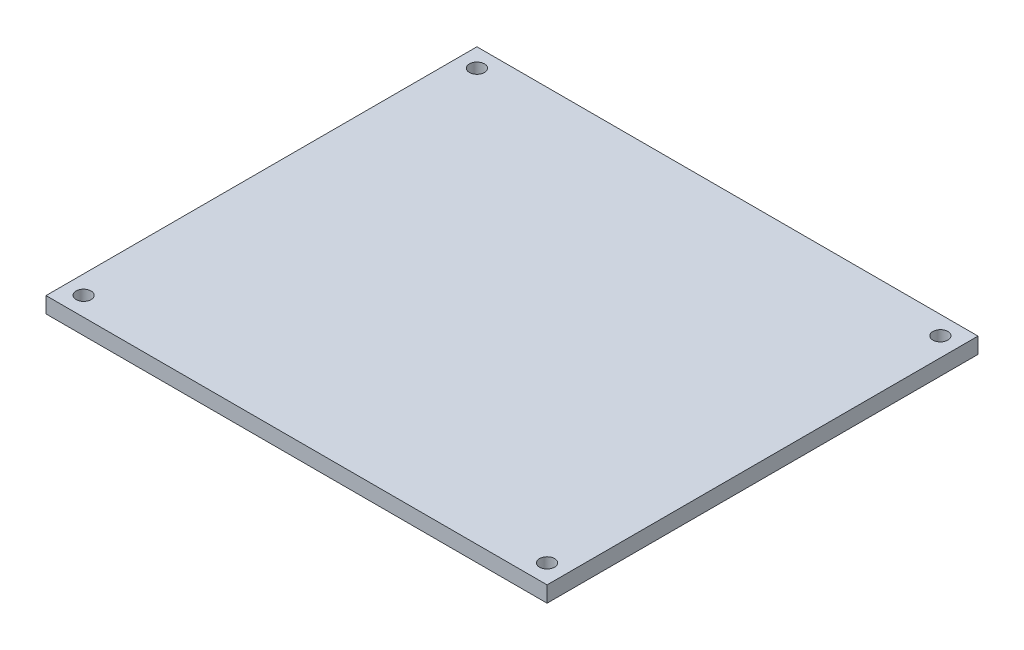
ISO-10303-21;
HEADER;
FILE_DESCRIPTION(('STEP AP214'),'2;1');
FILE_NAME('part.step','',(''),(''),'','','');
FILE_SCHEMA(('AUTOMOTIVE_DESIGN { 1 0 10303 214 1 1 1 1 }'));
ENDSEC;
DATA;
#1=APPLICATION_CONTEXT('core data for automotive mechanical design processes');
#2=APPLICATION_PROTOCOL_DEFINITION('international standard','automotive_design',2000,#1);
#3=PRODUCT_CONTEXT('',#1,'mechanical');
#4=PRODUCT('Part','Part','',(#3));
#5=PRODUCT_RELATED_PRODUCT_CATEGORY('part','',(#4));
#6=PRODUCT_DEFINITION_FORMATION('','',#4);
#7=PRODUCT_DEFINITION_CONTEXT('part definition',#1,'design');
#8=PRODUCT_DEFINITION('design','',#6,#7);
#9=PRODUCT_DEFINITION_SHAPE('','',#8);
#10=(LENGTH_UNIT() NAMED_UNIT(*) SI_UNIT(.MILLI.,.METRE.));
#11=(NAMED_UNIT(*) PLANE_ANGLE_UNIT() SI_UNIT($,.RADIAN.));
#12=(NAMED_UNIT(*) SI_UNIT($,.STERADIAN.) SOLID_ANGLE_UNIT());
#13=UNCERTAINTY_MEASURE_WITH_UNIT(LENGTH_MEASURE(1.E-05),#10,'distance_accuracy_value','');
#14=(GEOMETRIC_REPRESENTATION_CONTEXT(3) GLOBAL_UNCERTAINTY_ASSIGNED_CONTEXT((#13)) GLOBAL_UNIT_ASSIGNED_CONTEXT((#10,
#11,#12)) REPRESENTATION_CONTEXT('',''));
#15=CARTESIAN_POINT('',(0.,0.,0.));
#16=DIRECTION('',(0.,0.,1.));
#17=DIRECTION('',(1.,0.,0.));
#18=AXIS2_PLACEMENT_3D('',#15,#16,#17);
#19=CARTESIAN_POINT('',(0.,3.175,0.));
#20=DIRECTION('',(0.,-1.,0.));
#21=DIRECTION('',(0.,0.,-1.));
#22=AXIS2_PLACEMENT_3D('',#19,#20,#21);
#23=PLANE('',#22);
#24=DIRECTION('',(0.,0.,1.));
#25=VECTOR('',#24,1.);
#26=CARTESIAN_POINT('',(0.,3.175,0.));
#27=LINE('',#26,#25);
#28=CARTESIAN_POINT('',(0.,3.175,-86.));
#29=VERTEX_POINT('',#28);
#30=CARTESIAN_POINT('',(0.,3.175,0.));
#31=VERTEX_POINT('',#30);
#32=EDGE_CURVE('E90',#29,#31,#27,.T.);
#33=ORIENTED_EDGE('',*,*,#32,.T.);
#34=DIRECTION('',(1.,0.,0.));
#35=VECTOR('',#34,1.);
#36=CARTESIAN_POINT('',(0.,3.175,0.));
#37=LINE('',#36,#35);
#38=CARTESIAN_POINT('',(100.,3.175,0.));
#39=VERTEX_POINT('',#38);
#40=EDGE_CURVE('E85',#31,#39,#37,.T.);
#41=ORIENTED_EDGE('',*,*,#40,.T.);
#42=DIRECTION('',(0.,0.,-1.));
#43=VECTOR('',#42,1.);
#44=CARTESIAN_POINT('',(100.,3.175,0.));
#45=LINE('',#44,#43);
#46=CARTESIAN_POINT('',(100.,3.175,-86.));
#47=VERTEX_POINT('',#46);
#48=EDGE_CURVE('E88',#39,#47,#45,.T.);
#49=ORIENTED_EDGE('',*,*,#48,.T.);
#50=DIRECTION('',(-1.,0.,0.));
#51=VECTOR('',#50,1.);
#52=CARTESIAN_POINT('',(0.,3.175,-86.));
#53=LINE('',#52,#51);
#54=EDGE_CURVE('E55',#47,#29,#53,.T.);
#55=ORIENTED_EDGE('',*,*,#54,.T.);
#56=EDGE_LOOP('',(#33,#41,#49,#55));
#57=FACE_BOUND('',#56,.T.);
#58=CARTESIAN_POINT('',(3.69999999999998,3.175,-3.8));
#59=DIRECTION('',(0.,1.,0.));
#60=DIRECTION('',(0.,0.,1.));
#61=AXIS2_PLACEMENT_3D('',#58,#59,#60);
#62=CIRCLE('',#61,1.5);
#63=CARTESIAN_POINT('',(3.69999999999998,3.175,-2.3));
#64=VERTEX_POINT('',#63);
#65=EDGE_CURVE('E105',#64,#64,#62,.T.);
#66=ORIENTED_EDGE('',*,*,#65,.F.);
#67=EDGE_LOOP('',(#66));
#68=FACE_BOUND('',#67,.T.);
#69=CARTESIAN_POINT('',(96.2,3.175,-3.8));
#70=DIRECTION('',(0.,1.,0.));
#71=DIRECTION('',(0.,0.,1.));
#72=AXIS2_PLACEMENT_3D('',#69,#70,#71);
#73=CIRCLE('',#72,1.5);
#74=CARTESIAN_POINT('',(96.2,3.175,-2.3));
#75=VERTEX_POINT('',#74);
#76=EDGE_CURVE('E120',#75,#75,#73,.T.);
#77=ORIENTED_EDGE('',*,*,#76,.F.);
#78=EDGE_LOOP('',(#77));
#79=FACE_BOUND('',#78,.T.);
#80=CARTESIAN_POINT('',(3.69999999999997,3.175,-82.3));
#81=DIRECTION('',(0.,1.,0.));
#82=DIRECTION('',(0.,0.,1.));
#83=AXIS2_PLACEMENT_3D('',#80,#81,#82);
#84=CIRCLE('',#83,1.5);
#85=CARTESIAN_POINT('',(3.69999999999997,3.175,-80.8));
#86=VERTEX_POINT('',#85);
#87=EDGE_CURVE('E126',#86,#86,#84,.T.);
#88=ORIENTED_EDGE('',*,*,#87,.F.);
#89=EDGE_LOOP('',(#88));
#90=FACE_BOUND('',#89,.T.);
#91=CARTESIAN_POINT('',(96.2,3.175,-82.3));
#92=DIRECTION('',(0.,1.,0.));
#93=DIRECTION('',(0.,0.,1.));
#94=AXIS2_PLACEMENT_3D('',#91,#92,#93);
#95=CIRCLE('',#94,1.5);
#96=CARTESIAN_POINT('',(96.2,3.175,-80.8));
#97=VERTEX_POINT('',#96);
#98=EDGE_CURVE('E132',#97,#97,#95,.T.);
#99=ORIENTED_EDGE('',*,*,#98,.F.);
#100=EDGE_LOOP('',(#99));
#101=FACE_BOUND('',#100,.T.);
#102=ADVANCED_FACE('F38',(#57,#68,#79,#90,#101),#23,.F.);
#103=CARTESIAN_POINT('',(0.,0.,0.));
#104=DIRECTION('',(0.,-1.,0.));
#105=DIRECTION('',(0.,0.,-1.));
#106=AXIS2_PLACEMENT_3D('',#103,#104,#105);
#107=PLANE('',#106);
#108=CARTESIAN_POINT('',(3.69999999999997,0.,-82.3));
#109=DIRECTION('',(0.,1.,0.));
#110=DIRECTION('',(0.,0.,1.));
#111=AXIS2_PLACEMENT_3D('',#108,#109,#110);
#112=CIRCLE('',#111,1.5);
#113=CARTESIAN_POINT('',(3.69999999999997,0.,-80.8));
#114=VERTEX_POINT('',#113);
#115=EDGE_CURVE('E129',#114,#114,#112,.T.);
#116=ORIENTED_EDGE('',*,*,#115,.T.);
#117=EDGE_LOOP('',(#116));
#118=FACE_BOUND('',#117,.T.);
#119=CARTESIAN_POINT('',(3.69999999999998,0.,-3.8));
#120=DIRECTION('',(0.,1.,0.));
#121=DIRECTION('',(0.,0.,1.));
#122=AXIS2_PLACEMENT_3D('',#119,#120,#121);
#123=CIRCLE('',#122,1.5);
#124=CARTESIAN_POINT('',(3.69999999999998,0.,-2.3));
#125=VERTEX_POINT('',#124);
#126=EDGE_CURVE('E117',#125,#125,#123,.T.);
#127=ORIENTED_EDGE('',*,*,#126,.T.);
#128=EDGE_LOOP('',(#127));
#129=FACE_BOUND('',#128,.T.);
#130=DIRECTION('',(0.,0.,1.));
#131=VECTOR('',#130,1.);
#132=CARTESIAN_POINT('',(0.,0.,0.));
#133=LINE('',#132,#131);
#134=CARTESIAN_POINT('',(0.,0.,-86.));
#135=VERTEX_POINT('',#134);
#136=CARTESIAN_POINT('',(0.,0.,0.));
#137=VERTEX_POINT('',#136);
#138=EDGE_CURVE('E102',#135,#137,#133,.T.);
#139=ORIENTED_EDGE('',*,*,#138,.F.);
#140=DIRECTION('',(-1.,0.,0.));
#141=VECTOR('',#140,1.);
#142=CARTESIAN_POINT('',(0.,0.,-86.));
#143=LINE('',#142,#141);
#144=CARTESIAN_POINT('',(100.,0.,-86.));
#145=VERTEX_POINT('',#144);
#146=EDGE_CURVE('E78',#145,#135,#143,.T.);
#147=ORIENTED_EDGE('',*,*,#146,.F.);
#148=DIRECTION('',(0.,0.,-1.));
#149=VECTOR('',#148,1.);
#150=CARTESIAN_POINT('',(100.,0.,0.));
#151=LINE('',#150,#149);
#152=CARTESIAN_POINT('',(100.,0.,0.));
#153=VERTEX_POINT('',#152);
#154=EDGE_CURVE('E72',#153,#145,#151,.T.);
#155=ORIENTED_EDGE('',*,*,#154,.F.);
#156=DIRECTION('',(1.,0.,0.));
#157=VECTOR('',#156,1.);
#158=CARTESIAN_POINT('',(0.,0.,0.));
#159=LINE('',#158,#157);
#160=EDGE_CURVE('E94',#137,#153,#159,.T.);
#161=ORIENTED_EDGE('',*,*,#160,.F.);
#162=EDGE_LOOP('',(#139,#147,#155,#161));
#163=FACE_BOUND('',#162,.T.);
#164=CARTESIAN_POINT('',(96.2,0.,-3.8));
#165=DIRECTION('',(0.,1.,0.));
#166=DIRECTION('',(0.,0.,1.));
#167=AXIS2_PLACEMENT_3D('',#164,#165,#166);
#168=CIRCLE('',#167,1.5);
#169=CARTESIAN_POINT('',(96.2,0.,-2.3));
#170=VERTEX_POINT('',#169);
#171=EDGE_CURVE('E123',#170,#170,#168,.T.);
#172=ORIENTED_EDGE('',*,*,#171,.T.);
#173=EDGE_LOOP('',(#172));
#174=FACE_BOUND('',#173,.T.);
#175=CARTESIAN_POINT('',(96.2,0.,-82.3));
#176=DIRECTION('',(0.,1.,0.));
#177=DIRECTION('',(0.,0.,1.));
#178=AXIS2_PLACEMENT_3D('',#175,#176,#177);
#179=CIRCLE('',#178,1.5);
#180=CARTESIAN_POINT('',(96.2,0.,-80.8));
#181=VERTEX_POINT('',#180);
#182=EDGE_CURVE('E135',#181,#181,#179,.T.);
#183=ORIENTED_EDGE('',*,*,#182,.T.);
#184=EDGE_LOOP('',(#183));
#185=FACE_BOUND('',#184,.T.);
#186=ADVANCED_FACE('F113',(#118,#129,#163,#174,#185),#107,.T.);
#187=CARTESIAN_POINT('',(0.,3.175,0.));
#188=DIRECTION('',(1.,0.,0.));
#189=DIRECTION('',(0.,0.,-1.));
#190=AXIS2_PLACEMENT_3D('',#187,#188,#189);
#191=PLANE('',#190);
#192=ORIENTED_EDGE('',*,*,#138,.T.);
#193=DIRECTION('',(0.,-1.,0.));
#194=VECTOR('',#193,1.);
#195=CARTESIAN_POINT('',(0.,3.175,0.));
#196=LINE('',#195,#194);
#197=EDGE_CURVE('E11',#31,#137,#196,.T.);
#198=ORIENTED_EDGE('',*,*,#197,.F.);
#199=ORIENTED_EDGE('',*,*,#32,.F.);
#200=DIRECTION('',(0.,-1.,0.));
#201=VECTOR('',#200,1.);
#202=CARTESIAN_POINT('',(0.,3.175,-86.));
#203=LINE('',#202,#201);
#204=EDGE_CURVE('E98',#29,#135,#203,.T.);
#205=ORIENTED_EDGE('',*,*,#204,.T.);
#206=EDGE_LOOP('',(#192,#198,#199,#205));
#207=FACE_BOUND('',#206,.T.);
#208=ADVANCED_FACE('F40',(#207),#191,.F.);
#209=CARTESIAN_POINT('',(0.,3.175,0.));
#210=DIRECTION('',(0.,0.,-1.));
#211=DIRECTION('',(-1.,0.,0.));
#212=AXIS2_PLACEMENT_3D('',#209,#210,#211);
#213=PLANE('',#212);
#214=ORIENTED_EDGE('',*,*,#160,.T.);
#215=DIRECTION('',(0.,-1.,0.));
#216=VECTOR('',#215,1.);
#217=CARTESIAN_POINT('',(100.,3.175,0.));
#218=LINE('',#217,#216);
#219=EDGE_CURVE('E47',#39,#153,#218,.T.);
#220=ORIENTED_EDGE('',*,*,#219,.F.);
#221=ORIENTED_EDGE('',*,*,#40,.F.);
#222=ORIENTED_EDGE('',*,*,#197,.T.);
#223=EDGE_LOOP('',(#214,#220,#221,#222));
#224=FACE_BOUND('',#223,.T.);
#225=ADVANCED_FACE('F93',(#224),#213,.F.);
#226=CARTESIAN_POINT('',(100.,3.175,0.));
#227=DIRECTION('',(-1.,0.,0.));
#228=DIRECTION('',(0.,0.,1.));
#229=AXIS2_PLACEMENT_3D('',#226,#227,#228);
#230=PLANE('',#229);
#231=ORIENTED_EDGE('',*,*,#154,.T.);
#232=DIRECTION('',(0.,-1.,0.));
#233=VECTOR('',#232,1.);
#234=CARTESIAN_POINT('',(100.,3.175,-86.));
#235=LINE('',#234,#233);
#236=EDGE_CURVE('E95',#47,#145,#235,.T.);
#237=ORIENTED_EDGE('',*,*,#236,.F.);
#238=ORIENTED_EDGE('',*,*,#48,.F.);
#239=ORIENTED_EDGE('',*,*,#219,.T.);
#240=EDGE_LOOP('',(#231,#237,#238,#239));
#241=FACE_BOUND('',#240,.T.);
#242=ADVANCED_FACE('F96',(#241),#230,.F.);
#243=CARTESIAN_POINT('',(0.,3.175,-86.));
#244=DIRECTION('',(0.,0.,1.));
#245=DIRECTION('',(1.,0.,0.));
#246=AXIS2_PLACEMENT_3D('',#243,#244,#245);
#247=PLANE('',#246);
#248=ORIENTED_EDGE('',*,*,#146,.T.);
#249=ORIENTED_EDGE('',*,*,#204,.F.);
#250=ORIENTED_EDGE('',*,*,#54,.F.);
#251=ORIENTED_EDGE('',*,*,#236,.T.);
#252=EDGE_LOOP('',(#248,#249,#250,#251));
#253=FACE_BOUND('',#252,.T.);
#254=ADVANCED_FACE('F110',(#253),#247,.F.);
#255=CARTESIAN_POINT('',(3.69999999999998,3.175,-3.8));
#256=DIRECTION('',(0.,-1.,0.));
#257=DIRECTION('',(0.,0.,-1.));
#258=AXIS2_PLACEMENT_3D('',#255,#256,#257);
#259=CYLINDRICAL_SURFACE('',#258,1.5);
#260=ORIENTED_EDGE('',*,*,#65,.T.);
#261=EDGE_LOOP('',(#260));
#262=FACE_BOUND('',#261,.T.);
#263=ORIENTED_EDGE('',*,*,#126,.F.);
#264=EDGE_LOOP('',(#263));
#265=FACE_BOUND('',#264,.T.);
#266=ADVANCED_FACE('F152',(#262,#265),#259,.F.);
#267=CARTESIAN_POINT('',(96.2,3.175,-3.8));
#268=DIRECTION('',(0.,-1.,0.));
#269=DIRECTION('',(0.,0.,-1.));
#270=AXIS2_PLACEMENT_3D('',#267,#268,#269);
#271=CYLINDRICAL_SURFACE('',#270,1.5);
#272=ORIENTED_EDGE('',*,*,#76,.T.);
#273=EDGE_LOOP('',(#272));
#274=FACE_BOUND('',#273,.T.);
#275=ORIENTED_EDGE('',*,*,#171,.F.);
#276=EDGE_LOOP('',(#275));
#277=FACE_BOUND('',#276,.T.);
#278=ADVANCED_FACE('F208',(#274,#277),#271,.F.);
#279=CARTESIAN_POINT('',(3.69999999999997,3.175,-82.3));
#280=DIRECTION('',(0.,-1.,0.));
#281=DIRECTION('',(0.,0.,-1.));
#282=AXIS2_PLACEMENT_3D('',#279,#280,#281);
#283=CYLINDRICAL_SURFACE('',#282,1.5);
#284=ORIENTED_EDGE('',*,*,#87,.T.);
#285=EDGE_LOOP('',(#284));
#286=FACE_BOUND('',#285,.T.);
#287=ORIENTED_EDGE('',*,*,#115,.F.);
#288=EDGE_LOOP('',(#287));
#289=FACE_BOUND('',#288,.T.);
#290=ADVANCED_FACE('F217',(#286,#289),#283,.F.);
#291=CARTESIAN_POINT('',(96.2,3.175,-82.3));
#292=DIRECTION('',(0.,-1.,0.));
#293=DIRECTION('',(0.,0.,-1.));
#294=AXIS2_PLACEMENT_3D('',#291,#292,#293);
#295=CYLINDRICAL_SURFACE('',#294,1.5);
#296=ORIENTED_EDGE('',*,*,#98,.T.);
#297=EDGE_LOOP('',(#296));
#298=FACE_BOUND('',#297,.T.);
#299=ORIENTED_EDGE('',*,*,#182,.F.);
#300=EDGE_LOOP('',(#299));
#301=FACE_BOUND('',#300,.T.);
#302=ADVANCED_FACE('F141',(#298,#301),#295,.F.);
#303=CLOSED_SHELL('',(#102,#186,#208,#225,#242,#254,#266,#278,#290,#302));
#304=MANIFOLD_SOLID_BREP('B2',#303);
#305=ADVANCED_BREP_SHAPE_REPRESENTATION('',(#18,#304),#14);
#306=SHAPE_DEFINITION_REPRESENTATION(#9,#305);
ENDSEC;
END-ISO-10303-21;
